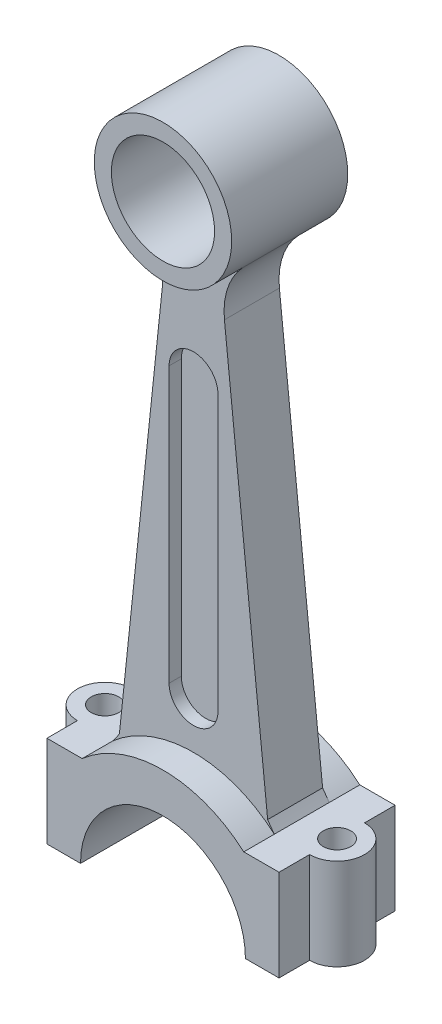
ISO-10303-21;
HEADER;
FILE_DESCRIPTION(('STEP AP214'),'2;1');
FILE_NAME('part.step','',(''),(''),'','','');
FILE_SCHEMA(('AUTOMOTIVE_DESIGN { 1 0 10303 214 1 1 1 1 }'));
ENDSEC;
DATA;
#1=APPLICATION_CONTEXT('core data for automotive mechanical design processes');
#2=APPLICATION_PROTOCOL_DEFINITION('international standard','automotive_design',2000,#1);
#3=PRODUCT_CONTEXT('',#1,'mechanical');
#4=PRODUCT('Part','Part','',(#3));
#5=PRODUCT_RELATED_PRODUCT_CATEGORY('part','',(#4));
#6=PRODUCT_DEFINITION_FORMATION('','',#4);
#7=PRODUCT_DEFINITION_CONTEXT('part definition',#1,'design');
#8=PRODUCT_DEFINITION('design','',#6,#7);
#9=PRODUCT_DEFINITION_SHAPE('','',#8);
#10=(LENGTH_UNIT() NAMED_UNIT(*) SI_UNIT(.MILLI.,.METRE.));
#11=(NAMED_UNIT(*) PLANE_ANGLE_UNIT() SI_UNIT($,.RADIAN.));
#12=(NAMED_UNIT(*) SI_UNIT($,.STERADIAN.) SOLID_ANGLE_UNIT());
#13=UNCERTAINTY_MEASURE_WITH_UNIT(LENGTH_MEASURE(1.E-05),#10,'distance_accuracy_value','');
#14=(GEOMETRIC_REPRESENTATION_CONTEXT(3) GLOBAL_UNCERTAINTY_ASSIGNED_CONTEXT((#13)) GLOBAL_UNIT_ASSIGNED_CONTEXT((#10,
#11,#12)) REPRESENTATION_CONTEXT('',''));
#15=CARTESIAN_POINT('',(0.,0.,0.));
#16=DIRECTION('',(0.,0.,1.));
#17=DIRECTION('',(1.,0.,0.));
#18=AXIS2_PLACEMENT_3D('',#15,#16,#17);
#19=CARTESIAN_POINT('',(0.,-69.3134123181224,-9.));
#20=DIRECTION('',(0.,0.,-1.));
#21=DIRECTION('',(1.,0.,0.));
#22=AXIS2_PLACEMENT_3D('',#19,#20,#21);
#23=PLANE('',#22);
#24=CARTESIAN_POINT('',(-32.5,100.761838686906,-9.));
#25=DIRECTION('',(0.,0.,-1.));
#26=DIRECTION('',(-1.,0.,0.));
#27=AXIS2_PLACEMENT_3D('',#24,#25,#26);
#28=CIRCLE('',#27,22.5);
#29=CARTESIAN_POINT('',(-10.1232573542138,98.4099482633835,-9.));
#30=VERTEX_POINT('',#29);
#31=CARTESIAN_POINT('',(-16.25,116.324213184392,-9.));
#32=VERTEX_POINT('',#31);
#33=EDGE_CURVE('E358',#30,#32,#28,.F.);
#34=ORIENTED_EDGE('',*,*,#33,.T.);
#35=CARTESIAN_POINT('',(0.,131.886587681878,-9.));
#36=DIRECTION('',(0.,0.,-1.));
#37=DIRECTION('',(1.,0.,0.));
#38=AXIS2_PLACEMENT_3D('',#35,#36,#37);
#39=CIRCLE('',#38,22.5);
#40=CARTESIAN_POINT('',(16.25,116.324213184392,-9.));
#41=VERTEX_POINT('',#40);
#42=EDGE_CURVE('E337',#41,#32,#39,.T.);
#43=ORIENTED_EDGE('',*,*,#42,.F.);
#44=CARTESIAN_POINT('',(32.5,100.761838686906,-9.));
#45=DIRECTION('',(0.,0.,-1.));
#46=DIRECTION('',(-1.,0.,0.));
#47=AXIS2_PLACEMENT_3D('',#44,#45,#46);
#48=CIRCLE('',#47,22.5);
#49=CARTESIAN_POINT('',(10.1232573542138,98.4099482633835,-9.));
#50=VERTEX_POINT('',#49);
#51=EDGE_CURVE('E352',#41,#50,#48,.F.);
#52=ORIENTED_EDGE('',*,*,#51,.T.);
#53=DIRECTION('',(0.104528463267655,-0.994521895368273,0.));
#54=VECTOR('',#53,1.);
#55=CARTESIAN_POINT('',(24.2766820798328,-36.2508928515591,-9.));
#56=LINE('',#55,#54);
#57=CARTESIAN_POINT('',(24.2766820798328,-36.2508928515591,-9.));
#58=VERTEX_POINT('',#57);
#59=EDGE_CURVE('E345',#50,#58,#56,.T.);
#60=ORIENTED_EDGE('',*,*,#59,.T.);
#61=CARTESIAN_POINT('',(106.81003769006,20.2136554218113,-9.));
#62=DIRECTION('',(0.,0.,-1.));
#63=DIRECTION('',(-1.,0.,0.));
#64=AXIS2_PLACEMENT_3D('',#61,#62,#63);
#65=CIRCLE('',#64,100.);
#66=CARTESIAN_POINT('',(26.4575131106459,-39.3134123181225,-9.));
#67=VERTEX_POINT('',#66);
#68=EDGE_CURVE('E349',#58,#67,#65,.F.);
#69=ORIENTED_EDGE('',*,*,#68,.T.);
#70=CARTESIAN_POINT('',(0.,-69.3134123181224,-9.));
#71=DIRECTION('',(0.,0.,-1.));
#72=DIRECTION('',(1.,0.,0.));
#73=AXIS2_PLACEMENT_3D('',#70,#71,#72);
#74=CIRCLE('',#73,40.);
#75=CARTESIAN_POINT('',(-26.4575131106459,-39.3134123181225,-9.));
#76=VERTEX_POINT('',#75);
#77=EDGE_CURVE('E335',#76,#67,#74,.T.);
#78=ORIENTED_EDGE('',*,*,#77,.F.);
#79=CARTESIAN_POINT('',(-106.81003769006,20.2136554218113,-9.));
#80=DIRECTION('',(0.,0.,-1.));
#81=DIRECTION('',(-1.,0.,0.));
#82=AXIS2_PLACEMENT_3D('',#79,#80,#81);
#83=CIRCLE('',#82,100.);
#84=CARTESIAN_POINT('',(-24.2766820798328,-36.2508928515591,-9.));
#85=VERTEX_POINT('',#84);
#86=EDGE_CURVE('E354',#76,#85,#83,.F.);
#87=ORIENTED_EDGE('',*,*,#86,.T.);
#88=DIRECTION('',(0.104528463267655,0.994521895368273,0.));
#89=VECTOR('',#88,1.);
#90=CARTESIAN_POINT('',(-24.2766820798328,-36.2508928515591,-9.));
#91=LINE('',#90,#89);
#92=EDGE_CURVE('E356',#85,#30,#91,.T.);
#93=ORIENTED_EDGE('',*,*,#92,.T.);
#94=EDGE_LOOP('',(#34,#43,#52,#60,#69,#78,#87,#93));
#95=FACE_BOUND('',#94,.T.);
#96=DIRECTION('',(0.,1.,0.));
#97=VECTOR('',#96,1.);
#98=CARTESIAN_POINT('',(8.,76.2865876818775,-9.));
#99=LINE('',#98,#97);
#100=CARTESIAN_POINT('',(8.00000000000001,-13.7134123181225,-9.));
#101=VERTEX_POINT('',#100);
#102=CARTESIAN_POINT('',(8.,76.2865876818775,-9.));
#103=VERTEX_POINT('',#102);
#104=EDGE_CURVE('E295',#101,#103,#99,.T.);
#105=ORIENTED_EDGE('',*,*,#104,.T.);
#106=CARTESIAN_POINT('',(0.,76.2865876818775,-9.));
#107=DIRECTION('',(0.,0.,1.));
#108=DIRECTION('',(1.,0.,0.));
#109=AXIS2_PLACEMENT_3D('',#106,#107,#108);
#110=CIRCLE('',#109,8.);
#111=CARTESIAN_POINT('',(-8.,76.2865876818775,-9.));
#112=VERTEX_POINT('',#111);
#113=EDGE_CURVE('E97',#103,#112,#110,.T.);
#114=ORIENTED_EDGE('',*,*,#113,.T.);
#115=DIRECTION('',(0.,-1.,0.));
#116=VECTOR('',#115,1.);
#117=CARTESIAN_POINT('',(-8.,76.2865876818775,-9.));
#118=LINE('',#117,#116);
#119=CARTESIAN_POINT('',(-7.99999999999999,-13.7134123181225,-9.));
#120=VERTEX_POINT('',#119);
#121=EDGE_CURVE('E286',#112,#120,#118,.T.);
#122=ORIENTED_EDGE('',*,*,#121,.T.);
#123=CARTESIAN_POINT('',(0.,-13.7134123181225,-9.));
#124=DIRECTION('',(0.,0.,1.));
#125=DIRECTION('',(1.,0.,0.));
#126=AXIS2_PLACEMENT_3D('',#123,#124,#125);
#127=CIRCLE('',#126,8.);
#128=EDGE_CURVE('E289',#120,#101,#127,.T.);
#129=ORIENTED_EDGE('',*,*,#128,.T.);
#130=EDGE_LOOP('',(#105,#114,#122,#129));
#131=FACE_BOUND('',#130,.T.);
#132=ADVANCED_FACE('F82',(#95,#131),#23,.T.);
#133=CARTESIAN_POINT('',(32.5,100.761838686906,19.));
#134=DIRECTION('',(0.,0.,-1.));
#135=DIRECTION('',(-1.,0.,0.));
#136=AXIS2_PLACEMENT_3D('',#133,#134,#135);
#137=CYLINDRICAL_SURFACE('',#136,22.5);
#138=ORIENTED_EDGE('',*,*,#51,.F.);
#139=DIRECTION('',(0.,0.,-1.));
#140=VECTOR('',#139,1.);
#141=CARTESIAN_POINT('',(16.25,116.324213184392,19.));
#142=LINE('',#141,#140);
#143=CARTESIAN_POINT('',(16.25,116.324213184392,9.));
#144=VERTEX_POINT('',#143);
#145=EDGE_CURVE('E495',#144,#41,#142,.T.);
#146=ORIENTED_EDGE('',*,*,#145,.F.);
#147=CARTESIAN_POINT('',(32.5,100.761838686906,9.));
#148=DIRECTION('',(0.,0.,1.));
#149=DIRECTION('',(1.,0.,0.));
#150=AXIS2_PLACEMENT_3D('',#147,#148,#149);
#151=CIRCLE('',#150,22.5);
#152=CARTESIAN_POINT('',(10.1232573542138,98.4099482633835,9.));
#153=VERTEX_POINT('',#152);
#154=EDGE_CURVE('E369',#153,#144,#151,.F.);
#155=ORIENTED_EDGE('',*,*,#154,.F.);
#156=DIRECTION('',(0.,0.,-1.));
#157=VECTOR('',#156,1.);
#158=CARTESIAN_POINT('',(10.1232573542138,98.4099482633835,19.));
#159=LINE('',#158,#157);
#160=EDGE_CURVE('E452',#153,#50,#159,.T.);
#161=ORIENTED_EDGE('',*,*,#160,.T.);
#162=EDGE_LOOP('',(#138,#146,#155,#161));
#163=FACE_BOUND('',#162,.T.);
#164=ADVANCED_FACE('F84',(#163),#137,.F.);
#165=CARTESIAN_POINT('',(-32.5,100.761838686906,19.));
#166=DIRECTION('',(0.,0.,-1.));
#167=DIRECTION('',(-1.,0.,0.));
#168=AXIS2_PLACEMENT_3D('',#165,#166,#167);
#169=CYLINDRICAL_SURFACE('',#168,22.5);
#170=ORIENTED_EDGE('',*,*,#33,.F.);
#171=DIRECTION('',(0.,0.,-1.));
#172=VECTOR('',#171,1.);
#173=CARTESIAN_POINT('',(-10.1232573542138,98.4099482633835,19.));
#174=LINE('',#173,#172);
#175=CARTESIAN_POINT('',(-10.1232573542138,98.4099482633835,9.));
#176=VERTEX_POINT('',#175);
#177=EDGE_CURVE('E489',#176,#30,#174,.T.);
#178=ORIENTED_EDGE('',*,*,#177,.F.);
#179=CARTESIAN_POINT('',(-32.5,100.761838686906,9.));
#180=DIRECTION('',(0.,0.,1.));
#181=DIRECTION('',(1.,0.,0.));
#182=AXIS2_PLACEMENT_3D('',#179,#180,#181);
#183=CIRCLE('',#182,22.5);
#184=CARTESIAN_POINT('',(-16.25,116.324213184392,9.));
#185=VERTEX_POINT('',#184);
#186=EDGE_CURVE('E375',#185,#176,#183,.F.);
#187=ORIENTED_EDGE('',*,*,#186,.F.);
#188=DIRECTION('',(0.,0.,-1.));
#189=VECTOR('',#188,1.);
#190=CARTESIAN_POINT('',(-16.25,116.324213184392,19.));
#191=LINE('',#190,#189);
#192=EDGE_CURVE('E492',#185,#32,#191,.T.);
#193=ORIENTED_EDGE('',*,*,#192,.T.);
#194=EDGE_LOOP('',(#170,#178,#187,#193));
#195=FACE_BOUND('',#194,.T.);
#196=ADVANCED_FACE('F532',(#195),#169,.F.);
#197=CARTESIAN_POINT('',(-24.2766820798328,-36.2508928515591,19.));
#198=DIRECTION('',(0.994521895368273,-0.104528463267655,0.));
#199=DIRECTION('',(0.104528463267655,0.994521895368273,0.));
#200=AXIS2_PLACEMENT_3D('',#197,#198,#199);
#201=PLANE('',#200);
#202=ORIENTED_EDGE('',*,*,#92,.F.);
#203=DIRECTION('',(0.,0.,-1.));
#204=VECTOR('',#203,1.);
#205=CARTESIAN_POINT('',(-24.2766820798328,-36.2508928515591,19.));
#206=LINE('',#205,#204);
#207=CARTESIAN_POINT('',(-24.2766820798328,-36.2508928515591,9.));
#208=VERTEX_POINT('',#207);
#209=EDGE_CURVE('E486',#208,#85,#206,.T.);
#210=ORIENTED_EDGE('',*,*,#209,.F.);
#211=DIRECTION('',(-0.104528463267655,-0.994521895368273,0.));
#212=VECTOR('',#211,1.);
#213=CARTESIAN_POINT('',(-24.2766820798328,-36.2508928515591,9.));
#214=LINE('',#213,#212);
#215=EDGE_CURVE('E373',#176,#208,#214,.T.);
#216=ORIENTED_EDGE('',*,*,#215,.F.);
#217=ORIENTED_EDGE('',*,*,#177,.T.);
#218=EDGE_LOOP('',(#202,#210,#216,#217));
#219=FACE_BOUND('',#218,.T.);
#220=ADVANCED_FACE('F617',(#219),#201,.F.);
#221=CARTESIAN_POINT('',(-106.81003769006,20.2136554218113,19.));
#222=DIRECTION('',(0.,0.,-1.));
#223=DIRECTION('',(-1.,0.,0.));
#224=AXIS2_PLACEMENT_3D('',#221,#222,#223);
#225=CYLINDRICAL_SURFACE('',#224,100.);
#226=ORIENTED_EDGE('',*,*,#86,.F.);
#227=DIRECTION('',(0.,0.,-1.));
#228=VECTOR('',#227,1.);
#229=CARTESIAN_POINT('',(-26.4575131106459,-39.3134123181225,19.));
#230=LINE('',#229,#228);
#231=CARTESIAN_POINT('',(-26.4575131106459,-39.3134123181225,9.));
#232=VERTEX_POINT('',#231);
#233=EDGE_CURVE('E482',#232,#76,#230,.T.);
#234=ORIENTED_EDGE('',*,*,#233,.F.);
#235=CARTESIAN_POINT('',(-106.81003769006,20.2136554218113,9.));
#236=DIRECTION('',(0.,0.,1.));
#237=DIRECTION('',(1.,0.,0.));
#238=AXIS2_PLACEMENT_3D('',#235,#236,#237);
#239=CIRCLE('',#238,100.);
#240=EDGE_CURVE('E371',#208,#232,#239,.F.);
#241=ORIENTED_EDGE('',*,*,#240,.F.);
#242=ORIENTED_EDGE('',*,*,#209,.T.);
#243=EDGE_LOOP('',(#226,#234,#241,#242));
#244=FACE_BOUND('',#243,.T.);
#245=ADVANCED_FACE('F612',(#244),#225,.F.);
#246=CARTESIAN_POINT('',(106.81003769006,20.2136554218113,19.));
#247=DIRECTION('',(0.,0.,-1.));
#248=DIRECTION('',(-1.,0.,0.));
#249=AXIS2_PLACEMENT_3D('',#246,#247,#248);
#250=CYLINDRICAL_SURFACE('',#249,100.);
#251=ORIENTED_EDGE('',*,*,#68,.F.);
#252=DIRECTION('',(0.,0.,-1.));
#253=VECTOR('',#252,1.);
#254=CARTESIAN_POINT('',(24.2766820798328,-36.2508928515591,19.));
#255=LINE('',#254,#253);
#256=CARTESIAN_POINT('',(24.2766820798328,-36.2508928515591,9.));
#257=VERTEX_POINT('',#256);
#258=EDGE_CURVE('E470',#257,#58,#255,.T.);
#259=ORIENTED_EDGE('',*,*,#258,.F.);
#260=CARTESIAN_POINT('',(106.81003769006,20.2136554218113,9.));
#261=DIRECTION('',(0.,0.,1.));
#262=DIRECTION('',(1.,0.,0.));
#263=AXIS2_PLACEMENT_3D('',#260,#261,#262);
#264=CIRCLE('',#263,100.);
#265=CARTESIAN_POINT('',(26.4575131106459,-39.3134123181225,9.));
#266=VERTEX_POINT('',#265);
#267=EDGE_CURVE('E366',#266,#257,#264,.F.);
#268=ORIENTED_EDGE('',*,*,#267,.F.);
#269=DIRECTION('',(0.,0.,-1.));
#270=VECTOR('',#269,1.);
#271=CARTESIAN_POINT('',(26.4575131106459,-39.3134123181225,19.));
#272=LINE('',#271,#270);
#273=EDGE_CURVE('E473',#266,#67,#272,.T.);
#274=ORIENTED_EDGE('',*,*,#273,.T.);
#275=EDGE_LOOP('',(#251,#259,#268,#274));
#276=FACE_BOUND('',#275,.T.);
#277=ADVANCED_FACE('F638',(#276),#250,.F.);
#278=CARTESIAN_POINT('',(24.2766820798328,-36.2508928515591,19.));
#279=DIRECTION('',(-0.994521895368273,-0.104528463267655,0.));
#280=DIRECTION('',(0.104528463267655,-0.994521895368273,0.));
#281=AXIS2_PLACEMENT_3D('',#278,#279,#280);
#282=PLANE('',#281);
#283=ORIENTED_EDGE('',*,*,#59,.F.);
#284=ORIENTED_EDGE('',*,*,#160,.F.);
#285=DIRECTION('',(-0.104528463267655,0.994521895368273,0.));
#286=VECTOR('',#285,1.);
#287=CARTESIAN_POINT('',(24.2766820798328,-36.2508928515591,9.));
#288=LINE('',#287,#286);
#289=EDGE_CURVE('E14',#257,#153,#288,.T.);
#290=ORIENTED_EDGE('',*,*,#289,.F.);
#291=ORIENTED_EDGE('',*,*,#258,.T.);
#292=EDGE_LOOP('',(#283,#284,#290,#291));
#293=FACE_BOUND('',#292,.T.);
#294=ADVANCED_FACE('F634',(#293),#282,.F.);
#295=CARTESIAN_POINT('',(32.5,100.761838686906,-19.));
#296=DIRECTION('',(0.,0.,1.));
#297=DIRECTION('',(1.,0.,0.));
#298=AXIS2_PLACEMENT_3D('',#295,#296,#297);
#299=PLANE('',#298);
#300=CARTESIAN_POINT('',(0.,-69.3134123181224,-19.));
#301=DIRECTION('',(0.,0.,-1.));
#302=DIRECTION('',(1.,0.,0.));
#303=AXIS2_PLACEMENT_3D('',#300,#301,#302);
#304=CIRCLE('',#303,40.);
#305=CARTESIAN_POINT('',(-26.4575131106459,-39.3134123181225,-19.));
#306=VERTEX_POINT('',#305);
#307=CARTESIAN_POINT('',(26.4575131106459,-39.3134123181225,-19.));
#308=VERTEX_POINT('',#307);
#309=EDGE_CURVE('E329',#306,#308,#304,.T.);
#310=ORIENTED_EDGE('',*,*,#309,.T.);
#311=DIRECTION('',(-1.,0.,0.));
#312=VECTOR('',#311,1.);
#313=CARTESIAN_POINT('',(47.,-39.3134123181225,-19.));
#314=LINE('',#313,#312);
#315=CARTESIAN_POINT('',(38.,-39.3134123181225,-19.));
#316=VERTEX_POINT('',#315);
#317=EDGE_CURVE('E439',#316,#308,#314,.T.);
#318=ORIENTED_EDGE('',*,*,#317,.F.);
#319=DIRECTION('',(0.,-1.,0.));
#320=VECTOR('',#319,1.);
#321=CARTESIAN_POINT('',(38.,-31.3134123181225,-19.));
#322=LINE('',#321,#320);
#323=CARTESIAN_POINT('',(38.,-69.3134123181224,-19.));
#324=VERTEX_POINT('',#323);
#325=EDGE_CURVE('E409',#316,#324,#322,.T.);
#326=ORIENTED_EDGE('',*,*,#325,.T.);
#327=DIRECTION('',(1.,0.,0.));
#328=VECTOR('',#327,1.);
#329=CARTESIAN_POINT('',(47.,-69.3134123181224,-19.));
#330=LINE('',#329,#328);
#331=CARTESIAN_POINT('',(27.,-69.3134123181224,-19.));
#332=VERTEX_POINT('',#331);
#333=EDGE_CURVE('E463',#332,#324,#330,.T.);
#334=ORIENTED_EDGE('',*,*,#333,.F.);
#335=CARTESIAN_POINT('',(0.,-69.3134123181224,-19.));
#336=DIRECTION('',(0.,0.,-1.));
#337=DIRECTION('',(1.,0.,0.));
#338=AXIS2_PLACEMENT_3D('',#335,#336,#337);
#339=CIRCLE('',#338,27.);
#340=CARTESIAN_POINT('',(-27.,-69.3134123181224,-19.));
#341=VERTEX_POINT('',#340);
#342=EDGE_CURVE('E460',#341,#332,#339,.T.);
#343=ORIENTED_EDGE('',*,*,#342,.F.);
#344=DIRECTION('',(1.,0.,0.));
#345=VECTOR('',#344,1.);
#346=CARTESIAN_POINT('',(-40.,-69.3134123181224,-19.));
#347=LINE('',#346,#345);
#348=CARTESIAN_POINT('',(-38.,-69.3134123181224,-19.));
#349=VERTEX_POINT('',#348);
#350=EDGE_CURVE('E458',#349,#341,#347,.T.);
#351=ORIENTED_EDGE('',*,*,#350,.F.);
#352=DIRECTION('',(0.,-1.,0.));
#353=VECTOR('',#352,1.);
#354=CARTESIAN_POINT('',(-38.,-31.3134123181225,-19.));
#355=LINE('',#354,#353);
#356=CARTESIAN_POINT('',(-38.,-39.3134123181225,-19.));
#357=VERTEX_POINT('',#356);
#358=EDGE_CURVE('E407',#357,#349,#355,.T.);
#359=ORIENTED_EDGE('',*,*,#358,.F.);
#360=DIRECTION('',(-1.,0.,0.));
#361=VECTOR('',#360,1.);
#362=CARTESIAN_POINT('',(-47.,-39.3134123181225,-19.));
#363=LINE('',#362,#361);
#364=EDGE_CURVE('E455',#306,#357,#363,.T.);
#365=ORIENTED_EDGE('',*,*,#364,.F.);
#366=EDGE_LOOP('',(#310,#318,#326,#334,#343,#351,#359,#365));
#367=FACE_BOUND('',#366,.T.);
#368=ADVANCED_FACE('F587',(#367),#299,.F.);
#369=CARTESIAN_POINT('',(0.,131.886587681878,-19.));
#370=DIRECTION('',(0.,0.,1.));
#371=DIRECTION('',(1.,0.,0.));
#372=AXIS2_PLACEMENT_3D('',#369,#370,#371);
#373=CIRCLE('',#372,16.9);
#374=CARTESIAN_POINT('',(16.9,131.886587681878,-19.));
#375=VERTEX_POINT('',#374);
#376=EDGE_CURVE('E428',#375,#375,#373,.T.);
#377=ORIENTED_EDGE('',*,*,#376,.T.);
#378=EDGE_LOOP('',(#377));
#379=FACE_BOUND('',#378,.T.);
#380=CARTESIAN_POINT('',(0.,131.886587681878,-19.));
#381=DIRECTION('',(0.,0.,1.));
#382=DIRECTION('',(1.,0.,0.));
#383=AXIS2_PLACEMENT_3D('',#380,#381,#382);
#384=CIRCLE('',#383,22.5);
#385=CARTESIAN_POINT('',(22.5,131.886587681878,-19.));
#386=VERTEX_POINT('',#385);
#387=EDGE_CURVE('E432',#386,#386,#384,.T.);
#388=ORIENTED_EDGE('',*,*,#387,.F.);
#389=EDGE_LOOP('',(#388));
#390=FACE_BOUND('',#389,.T.);
#391=ADVANCED_FACE('F655',(#379,#390),#299,.F.);
#392=CARTESIAN_POINT('',(32.5,100.761838686906,19.));
#393=DIRECTION('',(0.,0.,1.));
#394=DIRECTION('',(1.,0.,0.));
#395=AXIS2_PLACEMENT_3D('',#392,#393,#394);
#396=PLANE('',#395);
#397=CARTESIAN_POINT('',(0.,-69.3134123181224,19.));
#398=DIRECTION('',(0.,0.,-1.));
#399=DIRECTION('',(1.,0.,0.));
#400=AXIS2_PLACEMENT_3D('',#397,#398,#399);
#401=CIRCLE('',#400,40.);
#402=CARTESIAN_POINT('',(-26.4575131106459,-39.3134123181225,19.));
#403=VERTEX_POINT('',#402);
#404=CARTESIAN_POINT('',(26.4575131106459,-39.3134123181225,19.));
#405=VERTEX_POINT('',#404);
#406=EDGE_CURVE('E360',#403,#405,#401,.T.);
#407=ORIENTED_EDGE('',*,*,#406,.F.);
#408=DIRECTION('',(-1.,0.,0.));
#409=VECTOR('',#408,1.);
#410=CARTESIAN_POINT('',(-47.,-39.3134123181225,19.));
#411=LINE('',#410,#409);
#412=CARTESIAN_POINT('',(-38.,-39.3134123181225,19.));
#413=VERTEX_POINT('',#412);
#414=EDGE_CURVE('E438',#403,#413,#411,.T.);
#415=ORIENTED_EDGE('',*,*,#414,.T.);
#416=DIRECTION('',(0.,-1.,0.));
#417=VECTOR('',#416,1.);
#418=CARTESIAN_POINT('',(-38.,-31.3134123181225,19.));
#419=LINE('',#418,#417);
#420=CARTESIAN_POINT('',(-38.,-69.3134123181224,19.));
#421=VERTEX_POINT('',#420);
#422=EDGE_CURVE('E399',#413,#421,#419,.T.);
#423=ORIENTED_EDGE('',*,*,#422,.T.);
#424=DIRECTION('',(1.,0.,0.));
#425=VECTOR('',#424,1.);
#426=CARTESIAN_POINT('',(-47.,-69.3134123181224,19.));
#427=LINE('',#426,#425);
#428=CARTESIAN_POINT('',(-27.,-69.3134123181224,19.));
#429=VERTEX_POINT('',#428);
#430=EDGE_CURVE('E442',#421,#429,#427,.T.);
#431=ORIENTED_EDGE('',*,*,#430,.T.);
#432=CARTESIAN_POINT('',(0.,-69.3134123181224,19.));
#433=DIRECTION('',(0.,0.,-1.));
#434=DIRECTION('',(1.,0.,0.));
#435=AXIS2_PLACEMENT_3D('',#432,#433,#434);
#436=CIRCLE('',#435,27.);
#437=CARTESIAN_POINT('',(27.,-69.3134123181224,19.));
#438=VERTEX_POINT('',#437);
#439=EDGE_CURVE('E444',#429,#438,#436,.T.);
#440=ORIENTED_EDGE('',*,*,#439,.T.);
#441=DIRECTION('',(1.,0.,0.));
#442=VECTOR('',#441,1.);
#443=CARTESIAN_POINT('',(40.,-69.3134123181224,19.));
#444=LINE('',#443,#442);
#445=CARTESIAN_POINT('',(38.,-69.3134123181224,19.));
#446=VERTEX_POINT('',#445);
#447=EDGE_CURVE('E446',#438,#446,#444,.T.);
#448=ORIENTED_EDGE('',*,*,#447,.T.);
#449=DIRECTION('',(0.,-1.,0.));
#450=VECTOR('',#449,1.);
#451=CARTESIAN_POINT('',(38.,-31.3134123181225,19.));
#452=LINE('',#451,#450);
#453=CARTESIAN_POINT('',(38.,-39.3134123181225,19.));
#454=VERTEX_POINT('',#453);
#455=EDGE_CURVE('E397',#454,#446,#452,.T.);
#456=ORIENTED_EDGE('',*,*,#455,.F.);
#457=DIRECTION('',(-1.,0.,0.));
#458=VECTOR('',#457,1.);
#459=CARTESIAN_POINT('',(47.,-39.3134123181225,19.));
#460=LINE('',#459,#458);
#461=EDGE_CURVE('E449',#454,#405,#460,.T.);
#462=ORIENTED_EDGE('',*,*,#461,.T.);
#463=EDGE_LOOP('',(#407,#415,#423,#431,#440,#448,#456,#462));
#464=FACE_BOUND('',#463,.T.);
#465=ADVANCED_FACE('F646',(#464),#396,.T.);
#466=CARTESIAN_POINT('',(0.,131.886587681878,19.));
#467=DIRECTION('',(0.,0.,1.));
#468=DIRECTION('',(1.,0.,0.));
#469=AXIS2_PLACEMENT_3D('',#466,#467,#468);
#470=CIRCLE('',#469,22.5);
#471=CARTESIAN_POINT('',(22.5,131.886587681878,19.));
#472=VERTEX_POINT('',#471);
#473=EDGE_CURVE('E435',#472,#472,#470,.T.);
#474=ORIENTED_EDGE('',*,*,#473,.T.);
#475=EDGE_LOOP('',(#474));
#476=FACE_BOUND('',#475,.T.);
#477=CARTESIAN_POINT('',(0.,131.886587681878,19.));
#478=DIRECTION('',(0.,0.,1.));
#479=DIRECTION('',(1.,0.,0.));
#480=AXIS2_PLACEMENT_3D('',#477,#478,#479);
#481=CIRCLE('',#480,16.9);
#482=CARTESIAN_POINT('',(16.9,131.886587681878,19.));
#483=VERTEX_POINT('',#482);
#484=EDGE_CURVE('E429',#483,#483,#481,.T.);
#485=ORIENTED_EDGE('',*,*,#484,.F.);
#486=EDGE_LOOP('',(#485));
#487=FACE_BOUND('',#486,.T.);
#488=ADVANCED_FACE('F654',(#476,#487),#396,.T.);
#489=CARTESIAN_POINT('',(-47.,-39.3134123181225,19.));
#490=DIRECTION('',(0.,-1.,0.));
#491=DIRECTION('',(0.,0.,-1.));
#492=AXIS2_PLACEMENT_3D('',#489,#490,#491);
#493=PLANE('',#492);
#494=CARTESIAN_POINT('',(-38.,-39.3134123181225,0.));
#495=DIRECTION('',(0.,-1.,0.));
#496=DIRECTION('',(0.,0.,-1.));
#497=AXIS2_PLACEMENT_3D('',#494,#495,#496);
#498=CIRCLE('',#497,4.5);
#499=CARTESIAN_POINT('',(-38.,-39.3134123181225,-4.5));
#500=VERTEX_POINT('',#499);
#501=EDGE_CURVE('E419',#500,#500,#498,.T.);
#502=ORIENTED_EDGE('',*,*,#501,.T.);
#503=EDGE_LOOP('',(#502));
#504=FACE_BOUND('',#503,.T.);
#505=DIRECTION('',(0.,0.,-1.));
#506=VECTOR('',#505,1.);
#507=CARTESIAN_POINT('',(-38.,-39.3134123181225,19.));
#508=LINE('',#507,#506);
#509=CARTESIAN_POINT('',(-38.,-39.3134123181225,9.));
#510=VERTEX_POINT('',#509);
#511=EDGE_CURVE('E426',#413,#510,#508,.T.);
#512=ORIENTED_EDGE('',*,*,#511,.F.);
#513=ORIENTED_EDGE('',*,*,#414,.F.);
#514=EDGE_CURVE('E483',#403,#232,#230,.T.);
#515=ORIENTED_EDGE('',*,*,#514,.T.);
#516=ORIENTED_EDGE('',*,*,#233,.T.);
#517=DIRECTION('',(0.,0.,-1.));
#518=VECTOR('',#517,1.);
#519=CARTESIAN_POINT('',(-26.4575131106459,-39.3134123181225,-9.));
#520=LINE('',#519,#518);
#521=EDGE_CURVE('E340',#76,#306,#520,.T.);
#522=ORIENTED_EDGE('',*,*,#521,.T.);
#523=ORIENTED_EDGE('',*,*,#364,.T.);
#524=DIRECTION('',(0.,0.,-1.));
#525=VECTOR('',#524,1.);
#526=CARTESIAN_POINT('',(-38.,-39.3134123181225,19.));
#527=LINE('',#526,#525);
#528=CARTESIAN_POINT('',(-38.,-39.3134123181225,-9.));
#529=VERTEX_POINT('',#528);
#530=EDGE_CURVE('E422',#529,#357,#527,.T.);
#531=ORIENTED_EDGE('',*,*,#530,.F.);
#532=CARTESIAN_POINT('',(-38.,-39.3134123181225,0.));
#533=DIRECTION('',(0.,-1.,0.));
#534=DIRECTION('',(0.,0.,-1.));
#535=AXIS2_PLACEMENT_3D('',#532,#533,#534);
#536=CIRCLE('',#535,9.);
#537=EDGE_CURVE('E424',#510,#529,#536,.T.);
#538=ORIENTED_EDGE('',*,*,#537,.F.);
#539=EDGE_LOOP('',(#512,#513,#515,#516,#522,#523,#531,#538));
#540=FACE_BOUND('',#539,.T.);
#541=ADVANCED_FACE('F602',(#504,#540),#493,.F.);
#542=CARTESIAN_POINT('',(-40.,-69.3134123181224,19.));
#543=DIRECTION('',(0.,1.,0.));
#544=DIRECTION('',(0.,0.,1.));
#545=AXIS2_PLACEMENT_3D('',#542,#543,#544);
#546=PLANE('',#545);
#547=CARTESIAN_POINT('',(-38.,-69.3134123181224,0.));
#548=DIRECTION('',(0.,-1.,0.));
#549=DIRECTION('',(0.,0.,-1.));
#550=AXIS2_PLACEMENT_3D('',#547,#548,#549);
#551=CIRCLE('',#550,4.5);
#552=CARTESIAN_POINT('',(-38.,-69.3134123181224,-4.5));
#553=VERTEX_POINT('',#552);
#554=EDGE_CURVE('E415',#553,#553,#551,.T.);
#555=ORIENTED_EDGE('',*,*,#554,.F.);
#556=EDGE_LOOP('',(#555));
#557=FACE_BOUND('',#556,.T.);
#558=DIRECTION('',(0.,0.,-1.));
#559=VECTOR('',#558,1.);
#560=CARTESIAN_POINT('',(-38.,-69.3134123181224,0.));
#561=LINE('',#560,#559);
#562=CARTESIAN_POINT('',(-38.,-69.3134123181224,9.));
#563=VERTEX_POINT('',#562);
#564=EDGE_CURVE('E386',#421,#563,#561,.T.);
#565=ORIENTED_EDGE('',*,*,#564,.T.);
#566=CARTESIAN_POINT('',(-38.,-69.3134123181224,0.));
#567=DIRECTION('',(0.,-1.,0.));
#568=DIRECTION('',(0.,0.,-1.));
#569=AXIS2_PLACEMENT_3D('',#566,#567,#568);
#570=CIRCLE('',#569,9.);
#571=CARTESIAN_POINT('',(-38.,-69.3134123181224,-9.));
#572=VERTEX_POINT('',#571);
#573=EDGE_CURVE('E384',#563,#572,#570,.T.);
#574=ORIENTED_EDGE('',*,*,#573,.T.);
#575=DIRECTION('',(0.,0.,-1.));
#576=VECTOR('',#575,1.);
#577=CARTESIAN_POINT('',(-38.,-69.3134123181224,0.));
#578=LINE('',#577,#576);
#579=EDGE_CURVE('E381',#572,#349,#578,.T.);
#580=ORIENTED_EDGE('',*,*,#579,.T.);
#581=ORIENTED_EDGE('',*,*,#350,.T.);
#582=DIRECTION('',(0.,0.,-1.));
#583=VECTOR('',#582,1.);
#584=CARTESIAN_POINT('',(-27.,-69.3134123181224,19.));
#585=LINE('',#584,#583);
#586=EDGE_CURVE('E479',#429,#341,#585,.T.);
#587=ORIENTED_EDGE('',*,*,#586,.F.);
#588=ORIENTED_EDGE('',*,*,#430,.F.);
#589=EDGE_LOOP('',(#565,#574,#580,#581,#587,#588));
#590=FACE_BOUND('',#589,.T.);
#591=ADVANCED_FACE('F595',(#557,#590),#546,.F.);
#592=CARTESIAN_POINT('',(47.,-69.3134123181224,19.));
#593=DIRECTION('',(0.,1.,0.));
#594=DIRECTION('',(0.,0.,1.));
#595=AXIS2_PLACEMENT_3D('',#592,#593,#594);
#596=PLANE('',#595);
#597=CARTESIAN_POINT('',(38.,-69.3134123181224,0.));
#598=DIRECTION('',(0.,-1.,0.));
#599=DIRECTION('',(0.,0.,-1.));
#600=AXIS2_PLACEMENT_3D('',#597,#598,#599);
#601=CIRCLE('',#600,4.5);
#602=CARTESIAN_POINT('',(38.,-69.3134123181224,-4.5));
#603=VERTEX_POINT('',#602);
#604=EDGE_CURVE('E396',#603,#603,#601,.T.);
#605=ORIENTED_EDGE('',*,*,#604,.F.);
#606=EDGE_LOOP('',(#605));
#607=FACE_BOUND('',#606,.T.);
#608=CARTESIAN_POINT('',(38.,-69.3134123181224,0.));
#609=DIRECTION('',(0.,-1.,0.));
#610=DIRECTION('',(0.,0.,-1.));
#611=AXIS2_PLACEMENT_3D('',#608,#609,#610);
#612=CIRCLE('',#611,9.);
#613=CARTESIAN_POINT('',(38.,-69.3134123181224,-9.));
#614=VERTEX_POINT('',#613);
#615=CARTESIAN_POINT('',(38.,-69.3134123181224,9.));
#616=VERTEX_POINT('',#615);
#617=EDGE_CURVE('E377',#614,#616,#612,.T.);
#618=ORIENTED_EDGE('',*,*,#617,.T.);
#619=DIRECTION('',(0.,0.,-1.));
#620=VECTOR('',#619,1.);
#621=CARTESIAN_POINT('',(38.,-69.3134123181224,0.));
#622=LINE('',#621,#620);
#623=EDGE_CURVE('E389',#446,#616,#622,.T.);
#624=ORIENTED_EDGE('',*,*,#623,.F.);
#625=ORIENTED_EDGE('',*,*,#447,.F.);
#626=DIRECTION('',(0.,0.,-1.));
#627=VECTOR('',#626,1.);
#628=CARTESIAN_POINT('',(27.,-69.3134123181224,19.));
#629=LINE('',#628,#627);
#630=EDGE_CURVE('E476',#438,#332,#629,.T.);
#631=ORIENTED_EDGE('',*,*,#630,.T.);
#632=ORIENTED_EDGE('',*,*,#333,.T.);
#633=DIRECTION('',(0.,0.,-1.));
#634=VECTOR('',#633,1.);
#635=CARTESIAN_POINT('',(38.,-69.3134123181224,0.));
#636=LINE('',#635,#634);
#637=EDGE_CURVE('E379',#614,#324,#636,.T.);
#638=ORIENTED_EDGE('',*,*,#637,.F.);
#639=EDGE_LOOP('',(#618,#624,#625,#631,#632,#638));
#640=FACE_BOUND('',#639,.T.);
#641=ADVANCED_FACE('F582',(#607,#640),#596,.F.);
#642=CARTESIAN_POINT('',(47.,-39.3134123181225,19.));
#643=DIRECTION('',(0.,-1.,0.));
#644=DIRECTION('',(0.,0.,-1.));
#645=AXIS2_PLACEMENT_3D('',#642,#643,#644);
#646=PLANE('',#645);
#647=CARTESIAN_POINT('',(38.,-39.3134123181225,0.));
#648=DIRECTION('',(0.,-1.,0.));
#649=DIRECTION('',(0.,0.,-1.));
#650=AXIS2_PLACEMENT_3D('',#647,#648,#649);
#651=CIRCLE('',#650,4.5);
#652=CARTESIAN_POINT('',(38.,-39.3134123181225,-4.5));
#653=VERTEX_POINT('',#652);
#654=EDGE_CURVE('E418',#653,#653,#651,.T.);
#655=ORIENTED_EDGE('',*,*,#654,.T.);
#656=EDGE_LOOP('',(#655));
#657=FACE_BOUND('',#656,.T.);
#658=ORIENTED_EDGE('',*,*,#461,.F.);
#659=DIRECTION('',(0.,0.,-1.));
#660=VECTOR('',#659,1.);
#661=CARTESIAN_POINT('',(38.,-39.3134123181225,19.));
#662=LINE('',#661,#660);
#663=CARTESIAN_POINT('',(38.,-39.3134123181225,9.));
#664=VERTEX_POINT('',#663);
#665=EDGE_CURVE('E90',#454,#664,#662,.T.);
#666=ORIENTED_EDGE('',*,*,#665,.T.);
#667=CARTESIAN_POINT('',(38.,-39.3134123181225,0.));
#668=DIRECTION('',(0.,-1.,0.));
#669=DIRECTION('',(0.,0.,-1.));
#670=AXIS2_PLACEMENT_3D('',#667,#668,#669);
#671=CIRCLE('',#670,9.);
#672=CARTESIAN_POINT('',(38.,-39.3134123181225,-9.));
#673=VERTEX_POINT('',#672);
#674=EDGE_CURVE('E501',#673,#664,#671,.T.);
#675=ORIENTED_EDGE('',*,*,#674,.F.);
#676=DIRECTION('',(0.,0.,-1.));
#677=VECTOR('',#676,1.);
#678=CARTESIAN_POINT('',(38.,-39.3134123181225,19.));
#679=LINE('',#678,#677);
#680=EDGE_CURVE('E498',#673,#316,#679,.T.);
#681=ORIENTED_EDGE('',*,*,#680,.T.);
#682=ORIENTED_EDGE('',*,*,#317,.T.);
#683=DIRECTION('',(0.,0.,-1.));
#684=VECTOR('',#683,1.);
#685=CARTESIAN_POINT('',(26.4575131106459,-39.3134123181225,-9.));
#686=LINE('',#685,#684);
#687=EDGE_CURVE('E343',#67,#308,#686,.T.);
#688=ORIENTED_EDGE('',*,*,#687,.F.);
#689=ORIENTED_EDGE('',*,*,#273,.F.);
#690=EDGE_CURVE('E474',#405,#266,#272,.T.);
#691=ORIENTED_EDGE('',*,*,#690,.F.);
#692=EDGE_LOOP('',(#658,#666,#675,#681,#682,#688,#689,#691));
#693=FACE_BOUND('',#692,.T.);
#694=ADVANCED_FACE('F507',(#657,#693),#646,.F.);
#695=CARTESIAN_POINT('',(0.,131.886587681878,19.));
#696=DIRECTION('',(0.,0.,-1.));
#697=DIRECTION('',(-1.,0.,0.));
#698=AXIS2_PLACEMENT_3D('',#695,#696,#697);
#699=CYLINDRICAL_SURFACE('',#698,22.5);
#700=ORIENTED_EDGE('',*,*,#387,.T.);
#701=EDGE_LOOP('',(#700));
#702=FACE_BOUND('',#701,.T.);
#703=ORIENTED_EDGE('',*,*,#145,.T.);
#704=ORIENTED_EDGE('',*,*,#42,.T.);
#705=ORIENTED_EDGE('',*,*,#192,.F.);
#706=CARTESIAN_POINT('',(0.,131.886587681878,9.));
#707=DIRECTION('',(0.,0.,-1.));
#708=DIRECTION('',(1.,0.,0.));
#709=AXIS2_PLACEMENT_3D('',#706,#707,#708);
#710=CIRCLE('',#709,22.5);
#711=EDGE_CURVE('E364',#144,#185,#710,.T.);
#712=ORIENTED_EDGE('',*,*,#711,.F.);
#713=EDGE_LOOP('',(#703,#704,#705,#712));
#714=FACE_BOUND('',#713,.T.);
#715=ORIENTED_EDGE('',*,*,#473,.F.);
#716=EDGE_LOOP('',(#715));
#717=FACE_BOUND('',#716,.T.);
#718=ADVANCED_FACE('F625',(#702,#714,#717),#699,.T.);
#719=CARTESIAN_POINT('',(0.,-69.3134123181224,19.));
#720=DIRECTION('',(0.,0.,-1.));
#721=DIRECTION('',(-1.,0.,0.));
#722=AXIS2_PLACEMENT_3D('',#719,#720,#721);
#723=CYLINDRICAL_SURFACE('',#722,27.);
#724=ORIENTED_EDGE('',*,*,#342,.T.);
#725=ORIENTED_EDGE('',*,*,#630,.F.);
#726=ORIENTED_EDGE('',*,*,#439,.F.);
#727=ORIENTED_EDGE('',*,*,#586,.T.);
#728=EDGE_LOOP('',(#724,#725,#726,#727));
#729=FACE_BOUND('',#728,.T.);
#730=ADVANCED_FACE('F572',(#729),#723,.F.);
#731=CARTESIAN_POINT('',(0.,131.886587681878,19.));
#732=DIRECTION('',(0.,0.,-1.));
#733=DIRECTION('',(-1.,0.,0.));
#734=AXIS2_PLACEMENT_3D('',#731,#732,#733);
#735=CYLINDRICAL_SURFACE('',#734,16.9);
#736=ORIENTED_EDGE('',*,*,#484,.T.);
#737=EDGE_LOOP('',(#736));
#738=FACE_BOUND('',#737,.T.);
#739=ORIENTED_EDGE('',*,*,#376,.F.);
#740=EDGE_LOOP('',(#739));
#741=FACE_BOUND('',#740,.T.);
#742=ADVANCED_FACE('F567',(#738,#741),#735,.F.);
#743=CARTESIAN_POINT('',(38.,-31.3134123181225,0.));
#744=DIRECTION('',(-1.,0.,0.));
#745=DIRECTION('',(0.,0.,1.));
#746=AXIS2_PLACEMENT_3D('',#743,#744,#745);
#747=PLANE('',#746);
#748=DIRECTION('',(0.,-1.,0.));
#749=VECTOR('',#748,1.);
#750=CARTESIAN_POINT('',(38.,-31.3134123181225,-9.));
#751=LINE('',#750,#749);
#752=EDGE_CURVE('E392',#673,#614,#751,.T.);
#753=ORIENTED_EDGE('',*,*,#752,.T.);
#754=ORIENTED_EDGE('',*,*,#637,.T.);
#755=ORIENTED_EDGE('',*,*,#325,.F.);
#756=ORIENTED_EDGE('',*,*,#680,.F.);
#757=EDGE_LOOP('',(#753,#754,#755,#756));
#758=FACE_BOUND('',#757,.T.);
#759=ADVANCED_FACE('F554',(#758),#747,.F.);
#760=CARTESIAN_POINT('',(38.,-31.3134123181225,0.));
#761=DIRECTION('',(-1.,0.,0.));
#762=DIRECTION('',(0.,0.,1.));
#763=AXIS2_PLACEMENT_3D('',#760,#761,#762);
#764=PLANE('',#763);
#765=ORIENTED_EDGE('',*,*,#455,.T.);
#766=ORIENTED_EDGE('',*,*,#623,.T.);
#767=DIRECTION('',(0.,-1.,0.));
#768=VECTOR('',#767,1.);
#769=CARTESIAN_POINT('',(38.,-31.3134123181225,9.));
#770=LINE('',#769,#768);
#771=EDGE_CURVE('E393',#664,#616,#770,.T.);
#772=ORIENTED_EDGE('',*,*,#771,.F.);
#773=ORIENTED_EDGE('',*,*,#665,.F.);
#774=EDGE_LOOP('',(#765,#766,#772,#773));
#775=FACE_BOUND('',#774,.T.);
#776=ADVANCED_FACE('F523',(#775),#764,.F.);
#777=CARTESIAN_POINT('',(38.,-31.3134123181225,0.));
#778=DIRECTION('',(0.,-1.,0.));
#779=DIRECTION('',(0.,0.,-1.));
#780=AXIS2_PLACEMENT_3D('',#777,#778,#779);
#781=CYLINDRICAL_SURFACE('',#780,9.);
#782=ORIENTED_EDGE('',*,*,#674,.T.);
#783=ORIENTED_EDGE('',*,*,#771,.T.);
#784=ORIENTED_EDGE('',*,*,#617,.F.);
#785=ORIENTED_EDGE('',*,*,#752,.F.);
#786=EDGE_LOOP('',(#782,#783,#784,#785));
#787=FACE_BOUND('',#786,.T.);
#788=ADVANCED_FACE('F513',(#787),#781,.T.);
#789=CARTESIAN_POINT('',(38.,-31.3134123181225,0.));
#790=DIRECTION('',(0.,-1.,0.));
#791=DIRECTION('',(0.,0.,-1.));
#792=AXIS2_PLACEMENT_3D('',#789,#790,#791);
#793=CYLINDRICAL_SURFACE('',#792,4.5);
#794=ORIENTED_EDGE('',*,*,#604,.T.);
#795=EDGE_LOOP('',(#794));
#796=FACE_BOUND('',#795,.T.);
#797=ORIENTED_EDGE('',*,*,#654,.F.);
#798=EDGE_LOOP('',(#797));
#799=FACE_BOUND('',#798,.T.);
#800=ADVANCED_FACE('F510',(#796,#799),#793,.F.);
#801=CARTESIAN_POINT('',(-38.,-31.3134123181225,0.));
#802=DIRECTION('',(0.,-1.,0.));
#803=DIRECTION('',(0.,0.,-1.));
#804=AXIS2_PLACEMENT_3D('',#801,#802,#803);
#805=CYLINDRICAL_SURFACE('',#804,4.5);
#806=ORIENTED_EDGE('',*,*,#554,.T.);
#807=EDGE_LOOP('',(#806));
#808=FACE_BOUND('',#807,.T.);
#809=ORIENTED_EDGE('',*,*,#501,.F.);
#810=EDGE_LOOP('',(#809));
#811=FACE_BOUND('',#810,.T.);
#812=ADVANCED_FACE('F512',(#808,#811),#805,.F.);
#813=CARTESIAN_POINT('',(-38.,-31.3134123181225,0.));
#814=DIRECTION('',(-1.,0.,0.));
#815=DIRECTION('',(0.,0.,1.));
#816=AXIS2_PLACEMENT_3D('',#813,#814,#815);
#817=PLANE('',#816);
#818=ORIENTED_EDGE('',*,*,#511,.T.);
#819=DIRECTION('',(0.,-1.,0.));
#820=VECTOR('',#819,1.);
#821=CARTESIAN_POINT('',(-38.,-31.3134123181225,9.));
#822=LINE('',#821,#820);
#823=EDGE_CURVE('E402',#510,#563,#822,.T.);
#824=ORIENTED_EDGE('',*,*,#823,.T.);
#825=ORIENTED_EDGE('',*,*,#564,.F.);
#826=ORIENTED_EDGE('',*,*,#422,.F.);
#827=EDGE_LOOP('',(#818,#824,#825,#826));
#828=FACE_BOUND('',#827,.T.);
#829=ADVANCED_FACE('F520',(#828),#817,.T.);
#830=CARTESIAN_POINT('',(-38.,-31.3134123181225,0.));
#831=DIRECTION('',(0.,-1.,0.));
#832=DIRECTION('',(0.,0.,-1.));
#833=AXIS2_PLACEMENT_3D('',#830,#831,#832);
#834=CYLINDRICAL_SURFACE('',#833,9.);
#835=ORIENTED_EDGE('',*,*,#537,.T.);
#836=DIRECTION('',(0.,-1.,0.));
#837=VECTOR('',#836,1.);
#838=CARTESIAN_POINT('',(-38.,-31.3134123181225,-9.));
#839=LINE('',#838,#837);
#840=EDGE_CURVE('E404',#529,#572,#839,.T.);
#841=ORIENTED_EDGE('',*,*,#840,.T.);
#842=ORIENTED_EDGE('',*,*,#573,.F.);
#843=ORIENTED_EDGE('',*,*,#823,.F.);
#844=EDGE_LOOP('',(#835,#841,#842,#843));
#845=FACE_BOUND('',#844,.T.);
#846=ADVANCED_FACE('F558',(#845),#834,.T.);
#847=CARTESIAN_POINT('',(-38.,-31.3134123181225,0.));
#848=DIRECTION('',(-1.,0.,0.));
#849=DIRECTION('',(0.,0.,1.));
#850=AXIS2_PLACEMENT_3D('',#847,#848,#849);
#851=PLANE('',#850);
#852=ORIENTED_EDGE('',*,*,#530,.T.);
#853=ORIENTED_EDGE('',*,*,#358,.T.);
#854=ORIENTED_EDGE('',*,*,#579,.F.);
#855=ORIENTED_EDGE('',*,*,#840,.F.);
#856=EDGE_LOOP('',(#852,#853,#854,#855));
#857=FACE_BOUND('',#856,.T.);
#858=ADVANCED_FACE('F547',(#857),#851,.T.);
#859=CARTESIAN_POINT('',(0.,-69.3134123181224,9.));
#860=DIRECTION('',(0.,0.,1.));
#861=DIRECTION('',(1.,0.,0.));
#862=AXIS2_PLACEMENT_3D('',#859,#860,#861);
#863=PLANE('',#862);
#864=CARTESIAN_POINT('',(0.,76.2865876818775,9.));
#865=DIRECTION('',(0.,0.,1.));
#866=DIRECTION('',(1.,0.,0.));
#867=AXIS2_PLACEMENT_3D('',#864,#865,#866);
#868=CIRCLE('',#867,8.);
#869=CARTESIAN_POINT('',(8.,76.2865876818775,9.));
#870=VERTEX_POINT('',#869);
#871=CARTESIAN_POINT('',(-8.,76.2865876818775,9.));
#872=VERTEX_POINT('',#871);
#873=EDGE_CURVE('E105',#870,#872,#868,.T.);
#874=ORIENTED_EDGE('',*,*,#873,.F.);
#875=DIRECTION('',(0.,1.,0.));
#876=VECTOR('',#875,1.);
#877=CARTESIAN_POINT('',(8.,76.2865876818775,9.));
#878=LINE('',#877,#876);
#879=CARTESIAN_POINT('',(8.00000000000001,-13.7134123181225,9.));
#880=VERTEX_POINT('',#879);
#881=EDGE_CURVE('E308',#880,#870,#878,.T.);
#882=ORIENTED_EDGE('',*,*,#881,.F.);
#883=CARTESIAN_POINT('',(0.,-13.7134123181225,9.));
#884=DIRECTION('',(0.,0.,1.));
#885=DIRECTION('',(1.,0.,0.));
#886=AXIS2_PLACEMENT_3D('',#883,#884,#885);
#887=CIRCLE('',#886,8.);
#888=CARTESIAN_POINT('',(-7.99999999999999,-13.7134123181225,9.));
#889=VERTEX_POINT('',#888);
#890=EDGE_CURVE('E322',#889,#880,#887,.T.);
#891=ORIENTED_EDGE('',*,*,#890,.F.);
#892=DIRECTION('',(0.,-1.,0.));
#893=VECTOR('',#892,1.);
#894=CARTESIAN_POINT('',(-8.,76.2865876818775,9.));
#895=LINE('',#894,#893);
#896=EDGE_CURVE('E319',#872,#889,#895,.T.);
#897=ORIENTED_EDGE('',*,*,#896,.F.);
#898=EDGE_LOOP('',(#874,#882,#891,#897));
#899=FACE_BOUND('',#898,.T.);
#900=ORIENTED_EDGE('',*,*,#186,.T.);
#901=ORIENTED_EDGE('',*,*,#215,.T.);
#902=ORIENTED_EDGE('',*,*,#240,.T.);
#903=CARTESIAN_POINT('',(0.,-69.3134123181224,9.));
#904=DIRECTION('',(0.,0.,-1.));
#905=DIRECTION('',(1.,0.,0.));
#906=AXIS2_PLACEMENT_3D('',#903,#904,#905);
#907=CIRCLE('',#906,40.);
#908=EDGE_CURVE('E361',#232,#266,#907,.T.);
#909=ORIENTED_EDGE('',*,*,#908,.T.);
#910=ORIENTED_EDGE('',*,*,#267,.T.);
#911=ORIENTED_EDGE('',*,*,#289,.T.);
#912=ORIENTED_EDGE('',*,*,#154,.T.);
#913=ORIENTED_EDGE('',*,*,#711,.T.);
#914=EDGE_LOOP('',(#900,#901,#902,#909,#910,#911,#912,#913));
#915=FACE_BOUND('',#914,.T.);
#916=ADVANCED_FACE('F544',(#899,#915),#863,.T.);
#917=CARTESIAN_POINT('',(0.,-69.3134123181224,9.));
#918=DIRECTION('',(0.,0.,1.));
#919=DIRECTION('',(1.,0.,0.));
#920=AXIS2_PLACEMENT_3D('',#917,#918,#919);
#921=CYLINDRICAL_SURFACE('',#920,40.);
#922=ORIENTED_EDGE('',*,*,#406,.T.);
#923=ORIENTED_EDGE('',*,*,#690,.T.);
#924=ORIENTED_EDGE('',*,*,#908,.F.);
#925=ORIENTED_EDGE('',*,*,#514,.F.);
#926=EDGE_LOOP('',(#922,#923,#924,#925));
#927=FACE_BOUND('',#926,.T.);
#928=ADVANCED_FACE('F542',(#927),#921,.T.);
#929=CARTESIAN_POINT('',(0.,-69.3134123181224,-9.));
#930=DIRECTION('',(0.,0.,-1.));
#931=DIRECTION('',(-1.,0.,0.));
#932=AXIS2_PLACEMENT_3D('',#929,#930,#931);
#933=CYLINDRICAL_SURFACE('',#932,40.);
#934=ORIENTED_EDGE('',*,*,#309,.F.);
#935=ORIENTED_EDGE('',*,*,#521,.F.);
#936=ORIENTED_EDGE('',*,*,#77,.T.);
#937=ORIENTED_EDGE('',*,*,#687,.T.);
#938=EDGE_LOOP('',(#934,#935,#936,#937));
#939=FACE_BOUND('',#938,.T.);
#940=ADVANCED_FACE('F539',(#939),#933,.T.);
#941=CARTESIAN_POINT('',(0.,76.2865876818775,5.));
#942=DIRECTION('',(0.,0.,1.));
#943=DIRECTION('',(1.,0.,0.));
#944=AXIS2_PLACEMENT_3D('',#941,#942,#943);
#945=CYLINDRICAL_SURFACE('',#944,8.);
#946=ORIENTED_EDGE('',*,*,#873,.T.);
#947=DIRECTION('',(0.,0.,1.));
#948=VECTOR('',#947,1.);
#949=CARTESIAN_POINT('',(-8.,76.2865876818775,5.));
#950=LINE('',#949,#948);
#951=CARTESIAN_POINT('',(-8.,76.2865876818775,5.));
#952=VERTEX_POINT('',#951);
#953=EDGE_CURVE('E317',#952,#872,#950,.T.);
#954=ORIENTED_EDGE('',*,*,#953,.F.);
#955=CARTESIAN_POINT('',(0.,76.2865876818775,5.));
#956=DIRECTION('',(0.,0.,1.));
#957=DIRECTION('',(1.,0.,0.));
#958=AXIS2_PLACEMENT_3D('',#955,#956,#957);
#959=CIRCLE('',#958,8.);
#960=CARTESIAN_POINT('',(8.,76.2865876818775,5.));
#961=VERTEX_POINT('',#960);
#962=EDGE_CURVE('E304',#961,#952,#959,.T.);
#963=ORIENTED_EDGE('',*,*,#962,.F.);
#964=DIRECTION('',(0.,0.,1.));
#965=VECTOR('',#964,1.);
#966=CARTESIAN_POINT('',(8.,76.2865876818775,5.));
#967=LINE('',#966,#965);
#968=EDGE_CURVE('E327',#961,#870,#967,.T.);
#969=ORIENTED_EDGE('',*,*,#968,.T.);
#970=EDGE_LOOP('',(#946,#954,#963,#969));
#971=FACE_BOUND('',#970,.T.);
#972=ADVANCED_FACE('F537',(#971),#945,.F.);
#973=CARTESIAN_POINT('',(8.,76.2865876818775,5.));
#974=DIRECTION('',(1.,0.,0.));
#975=DIRECTION('',(0.,1.,0.));
#976=AXIS2_PLACEMENT_3D('',#973,#974,#975);
#977=PLANE('',#976);
#978=ORIENTED_EDGE('',*,*,#881,.T.);
#979=ORIENTED_EDGE('',*,*,#968,.F.);
#980=DIRECTION('',(0.,1.,0.));
#981=VECTOR('',#980,1.);
#982=CARTESIAN_POINT('',(8.,76.2865876818775,5.));
#983=LINE('',#982,#981);
#984=CARTESIAN_POINT('',(8.00000000000001,-13.7134123181225,5.));
#985=VERTEX_POINT('',#984);
#986=EDGE_CURVE('E314',#985,#961,#983,.T.);
#987=ORIENTED_EDGE('',*,*,#986,.F.);
#988=DIRECTION('',(0.,0.,1.));
#989=VECTOR('',#988,1.);
#990=CARTESIAN_POINT('',(8.00000000000001,-13.7134123181225,5.));
#991=LINE('',#990,#989);
#992=EDGE_CURVE('E330',#985,#880,#991,.T.);
#993=ORIENTED_EDGE('',*,*,#992,.T.);
#994=EDGE_LOOP('',(#978,#979,#987,#993));
#995=FACE_BOUND('',#994,.T.);
#996=ADVANCED_FACE('F861',(#995),#977,.F.);
#997=CARTESIAN_POINT('',(0.,-13.7134123181225,5.));
#998=DIRECTION('',(0.,0.,1.));
#999=DIRECTION('',(1.,0.,0.));
#1000=AXIS2_PLACEMENT_3D('',#997,#998,#999);
#1001=CYLINDRICAL_SURFACE('',#1000,8.);
#1002=ORIENTED_EDGE('',*,*,#890,.T.);
#1003=ORIENTED_EDGE('',*,*,#992,.F.);
#1004=CARTESIAN_POINT('',(0.,-13.7134123181225,5.));
#1005=DIRECTION('',(0.,0.,1.));
#1006=DIRECTION('',(1.,0.,0.));
#1007=AXIS2_PLACEMENT_3D('',#1004,#1005,#1006);
#1008=CIRCLE('',#1007,8.);
#1009=CARTESIAN_POINT('',(-7.99999999999999,-13.7134123181225,5.));
#1010=VERTEX_POINT('',#1009);
#1011=EDGE_CURVE('E311',#1010,#985,#1008,.T.);
#1012=ORIENTED_EDGE('',*,*,#1011,.F.);
#1013=DIRECTION('',(0.,0.,1.));
#1014=VECTOR('',#1013,1.);
#1015=CARTESIAN_POINT('',(-7.99999999999999,-13.7134123181225,5.));
#1016=LINE('',#1015,#1014);
#1017=EDGE_CURVE('E332',#1010,#889,#1016,.T.);
#1018=ORIENTED_EDGE('',*,*,#1017,.T.);
#1019=EDGE_LOOP('',(#1002,#1003,#1012,#1018));
#1020=FACE_BOUND('',#1019,.T.);
#1021=ADVANCED_FACE('F868',(#1020),#1001,.F.);
#1022=CARTESIAN_POINT('',(-8.,76.2865876818775,5.));
#1023=DIRECTION('',(-1.,0.,0.));
#1024=DIRECTION('',(0.,-1.,0.));
#1025=AXIS2_PLACEMENT_3D('',#1022,#1023,#1024);
#1026=PLANE('',#1025);
#1027=ORIENTED_EDGE('',*,*,#896,.T.);
#1028=ORIENTED_EDGE('',*,*,#1017,.F.);
#1029=DIRECTION('',(0.,-1.,0.));
#1030=VECTOR('',#1029,1.);
#1031=CARTESIAN_POINT('',(-8.,76.2865876818775,5.));
#1032=LINE('',#1031,#1030);
#1033=EDGE_CURVE('E307',#952,#1010,#1032,.T.);
#1034=ORIENTED_EDGE('',*,*,#1033,.F.);
#1035=ORIENTED_EDGE('',*,*,#953,.T.);
#1036=EDGE_LOOP('',(#1027,#1028,#1034,#1035));
#1037=FACE_BOUND('',#1036,.T.);
#1038=ADVANCED_FACE('F877',(#1037),#1026,.F.);
#1039=CARTESIAN_POINT('',(0.,76.2865876818775,5.));
#1040=DIRECTION('',(0.,0.,1.));
#1041=DIRECTION('',(1.,0.,0.));
#1042=AXIS2_PLACEMENT_3D('',#1039,#1040,#1041);
#1043=PLANE('',#1042);
#1044=ORIENTED_EDGE('',*,*,#962,.T.);
#1045=ORIENTED_EDGE('',*,*,#1033,.T.);
#1046=ORIENTED_EDGE('',*,*,#1011,.T.);
#1047=ORIENTED_EDGE('',*,*,#986,.T.);
#1048=EDGE_LOOP('',(#1044,#1045,#1046,#1047));
#1049=FACE_BOUND('',#1048,.T.);
#1050=ADVANCED_FACE('F886',(#1049),#1043,.T.);
#1051=CARTESIAN_POINT('',(0.,76.2865876818775,-5.));
#1052=DIRECTION('',(0.,0.,-1.));
#1053=DIRECTION('',(-1.,0.,0.));
#1054=AXIS2_PLACEMENT_3D('',#1051,#1052,#1053);
#1055=CYLINDRICAL_SURFACE('',#1054,8.);
#1056=ORIENTED_EDGE('',*,*,#113,.F.);
#1057=DIRECTION('',(0.,0.,-1.));
#1058=VECTOR('',#1057,1.);
#1059=CARTESIAN_POINT('',(8.,76.2865876818775,-5.));
#1060=LINE('',#1059,#1058);
#1061=CARTESIAN_POINT('',(8.,76.2865876818775,-5.));
#1062=VERTEX_POINT('',#1061);
#1063=EDGE_CURVE('E271',#1062,#103,#1060,.T.);
#1064=ORIENTED_EDGE('',*,*,#1063,.F.);
#1065=CARTESIAN_POINT('',(0.,76.2865876818775,-5.));
#1066=DIRECTION('',(0.,0.,1.));
#1067=DIRECTION('',(1.,0.,0.));
#1068=AXIS2_PLACEMENT_3D('',#1065,#1066,#1067);
#1069=CIRCLE('',#1068,8.);
#1070=CARTESIAN_POINT('',(-8.,76.2865876818775,-5.));
#1071=VERTEX_POINT('',#1070);
#1072=EDGE_CURVE('E278',#1062,#1071,#1069,.T.);
#1073=ORIENTED_EDGE('',*,*,#1072,.T.);
#1074=DIRECTION('',(0.,0.,-1.));
#1075=VECTOR('',#1074,1.);
#1076=CARTESIAN_POINT('',(-8.,76.2865876818775,-5.));
#1077=LINE('',#1076,#1075);
#1078=EDGE_CURVE('E299',#1071,#112,#1077,.T.);
#1079=ORIENTED_EDGE('',*,*,#1078,.T.);
#1080=EDGE_LOOP('',(#1056,#1064,#1073,#1079));
#1081=FACE_BOUND('',#1080,.T.);
#1082=ADVANCED_FACE('F281',(#1081),#1055,.F.);
#1083=CARTESIAN_POINT('',(-8.,76.2865876818775,-5.));
#1084=DIRECTION('',(1.,0.,0.));
#1085=DIRECTION('',(0.,1.,0.));
#1086=AXIS2_PLACEMENT_3D('',#1083,#1084,#1085);
#1087=PLANE('',#1086);
#1088=ORIENTED_EDGE('',*,*,#121,.F.);
#1089=ORIENTED_EDGE('',*,*,#1078,.F.);
#1090=DIRECTION('',(0.,-1.,0.));
#1091=VECTOR('',#1090,1.);
#1092=CARTESIAN_POINT('',(-8.,76.2865876818775,-5.));
#1093=LINE('',#1092,#1091);
#1094=CARTESIAN_POINT('',(-7.99999999999999,-13.7134123181225,-5.));
#1095=VERTEX_POINT('',#1094);
#1096=EDGE_CURVE('E283',#1071,#1095,#1093,.T.);
#1097=ORIENTED_EDGE('',*,*,#1096,.T.);
#1098=DIRECTION('',(0.,0.,-1.));
#1099=VECTOR('',#1098,1.);
#1100=CARTESIAN_POINT('',(-7.99999999999999,-13.7134123181225,-5.));
#1101=LINE('',#1100,#1099);
#1102=EDGE_CURVE('E301',#1095,#120,#1101,.T.);
#1103=ORIENTED_EDGE('',*,*,#1102,.T.);
#1104=EDGE_LOOP('',(#1088,#1089,#1097,#1103));
#1105=FACE_BOUND('',#1104,.T.);
#1106=ADVANCED_FACE('F906',(#1105),#1087,.T.);
#1107=CARTESIAN_POINT('',(0.,-13.7134123181225,-5.));
#1108=DIRECTION('',(0.,0.,-1.));
#1109=DIRECTION('',(-1.,0.,0.));
#1110=AXIS2_PLACEMENT_3D('',#1107,#1108,#1109);
#1111=CYLINDRICAL_SURFACE('',#1110,8.);
#1112=ORIENTED_EDGE('',*,*,#128,.F.);
#1113=ORIENTED_EDGE('',*,*,#1102,.F.);
#1114=CARTESIAN_POINT('',(0.,-13.7134123181225,-5.));
#1115=DIRECTION('',(0.,0.,1.));
#1116=DIRECTION('',(1.,0.,0.));
#1117=AXIS2_PLACEMENT_3D('',#1114,#1115,#1116);
#1118=CIRCLE('',#1117,8.);
#1119=CARTESIAN_POINT('',(8.00000000000001,-13.7134123181225,-5.));
#1120=VERTEX_POINT('',#1119);
#1121=EDGE_CURVE('E277',#1095,#1120,#1118,.T.);
#1122=ORIENTED_EDGE('',*,*,#1121,.T.);
#1123=DIRECTION('',(0.,0.,-1.));
#1124=VECTOR('',#1123,1.);
#1125=CARTESIAN_POINT('',(8.00000000000001,-13.7134123181225,-5.));
#1126=LINE('',#1125,#1124);
#1127=EDGE_CURVE('E273',#1120,#101,#1126,.T.);
#1128=ORIENTED_EDGE('',*,*,#1127,.T.);
#1129=EDGE_LOOP('',(#1112,#1113,#1122,#1128));
#1130=FACE_BOUND('',#1129,.T.);
#1131=ADVANCED_FACE('F914',(#1130),#1111,.F.);
#1132=CARTESIAN_POINT('',(8.,76.2865876818775,-5.));
#1133=DIRECTION('',(-1.,0.,0.));
#1134=DIRECTION('',(0.,-1.,0.));
#1135=AXIS2_PLACEMENT_3D('',#1132,#1133,#1134);
#1136=PLANE('',#1135);
#1137=ORIENTED_EDGE('',*,*,#104,.F.);
#1138=ORIENTED_EDGE('',*,*,#1127,.F.);
#1139=DIRECTION('',(0.,1.,0.));
#1140=VECTOR('',#1139,1.);
#1141=CARTESIAN_POINT('',(8.,76.2865876818775,-5.));
#1142=LINE('',#1141,#1140);
#1143=EDGE_CURVE('E268',#1120,#1062,#1142,.T.);
#1144=ORIENTED_EDGE('',*,*,#1143,.T.);
#1145=ORIENTED_EDGE('',*,*,#1063,.T.);
#1146=EDGE_LOOP('',(#1137,#1138,#1144,#1145));
#1147=FACE_BOUND('',#1146,.T.);
#1148=ADVANCED_FACE('F270',(#1147),#1136,.T.);
#1149=CARTESIAN_POINT('',(0.,76.2865876818775,-5.));
#1150=DIRECTION('',(0.,0.,-1.));
#1151=DIRECTION('',(1.,0.,0.));
#1152=AXIS2_PLACEMENT_3D('',#1149,#1150,#1151);
#1153=PLANE('',#1152);
#1154=ORIENTED_EDGE('',*,*,#1072,.F.);
#1155=ORIENTED_EDGE('',*,*,#1143,.F.);
#1156=ORIENTED_EDGE('',*,*,#1121,.F.);
#1157=ORIENTED_EDGE('',*,*,#1096,.F.);
#1158=EDGE_LOOP('',(#1154,#1155,#1156,#1157));
#1159=FACE_BOUND('',#1158,.T.);
#1160=ADVANCED_FACE('F285',(#1159),#1153,.T.);
#1161=CLOSED_SHELL('',(#132,#164,#196,#220,#245,#277,#294,#368,#391,#465,#488,#541,#591,#641,
#694,#718,#730,#742,#759,#776,#788,#800,#812,#829,#846,#858,#916,#928,#940,#972,#996,#1021,
#1038,#1050,#1082,#1106,#1131,#1148,#1160));
#1162=MANIFOLD_SOLID_BREP('B2',#1161);
#1163=ADVANCED_BREP_SHAPE_REPRESENTATION('',(#18,#1162),#14);
#1164=SHAPE_DEFINITION_REPRESENTATION(#9,#1163);
ENDSEC;
END-ISO-10303-21;
